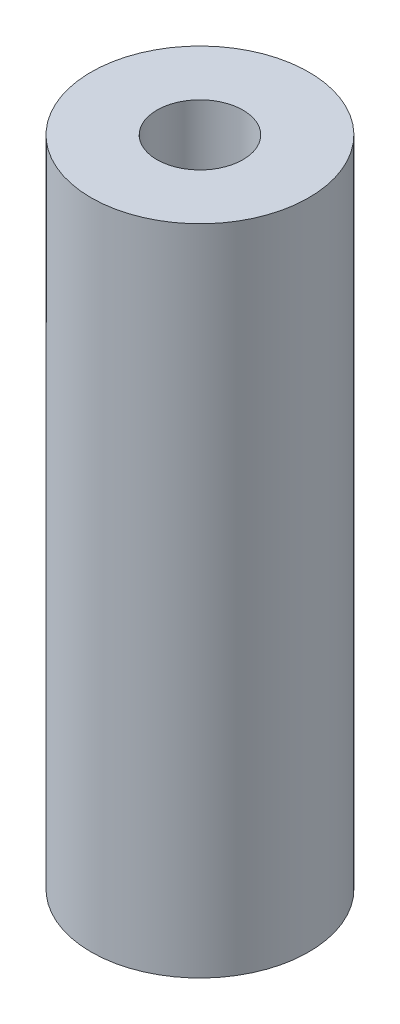
ISO-10303-21;
HEADER;
FILE_DESCRIPTION(('STEP AP214'),'2;1');
FILE_NAME('part.step','',(''),(''),'','','');
FILE_SCHEMA(('AUTOMOTIVE_DESIGN { 1 0 10303 214 1 1 1 1 }'));
ENDSEC;
DATA;
#1=APPLICATION_CONTEXT('core data for automotive mechanical design processes');
#2=APPLICATION_PROTOCOL_DEFINITION('international standard','automotive_design',2000,#1);
#3=PRODUCT_CONTEXT('',#1,'mechanical');
#4=PRODUCT('Part','Part','',(#3));
#5=PRODUCT_RELATED_PRODUCT_CATEGORY('part','',(#4));
#6=PRODUCT_DEFINITION_FORMATION('','',#4);
#7=PRODUCT_DEFINITION_CONTEXT('part definition',#1,'design');
#8=PRODUCT_DEFINITION('design','',#6,#7);
#9=PRODUCT_DEFINITION_SHAPE('','',#8);
#10=(LENGTH_UNIT() NAMED_UNIT(*) SI_UNIT(.MILLI.,.METRE.));
#11=(NAMED_UNIT(*) PLANE_ANGLE_UNIT() SI_UNIT($,.RADIAN.));
#12=(NAMED_UNIT(*) SI_UNIT($,.STERADIAN.) SOLID_ANGLE_UNIT());
#13=UNCERTAINTY_MEASURE_WITH_UNIT(LENGTH_MEASURE(1.E-05),#10,'distance_accuracy_value','');
#14=(GEOMETRIC_REPRESENTATION_CONTEXT(3) GLOBAL_UNCERTAINTY_ASSIGNED_CONTEXT((#13)) GLOBAL_UNIT_ASSIGNED_CONTEXT((#10,
#11,#12)) REPRESENTATION_CONTEXT('',''));
#15=CARTESIAN_POINT('',(0.,0.,0.));
#16=DIRECTION('',(0.,0.,1.));
#17=DIRECTION('',(1.,0.,0.));
#18=AXIS2_PLACEMENT_3D('',#15,#16,#17);
#19=CARTESIAN_POINT('',(0.,12.,0.));
#20=DIRECTION('',(0.,1.,0.));
#21=DIRECTION('',(0.,0.,1.));
#22=AXIS2_PLACEMENT_3D('',#19,#20,#21);
#23=PLANE('',#22);
#24=CARTESIAN_POINT('',(0.,12.,0.));
#25=DIRECTION('',(0.,1.,0.));
#26=DIRECTION('',(0.,0.,1.));
#27=AXIS2_PLACEMENT_3D('',#24,#25,#26);
#28=CIRCLE('',#27,2.);
#29=CARTESIAN_POINT('',(0.,12.,2.));
#30=VERTEX_POINT('',#29);
#31=EDGE_CURVE('E10',#30,#30,#28,.T.);
#32=ORIENTED_EDGE('',*,*,#31,.T.);
#33=EDGE_LOOP('',(#32));
#34=FACE_BOUND('',#33,.T.);
#35=CARTESIAN_POINT('',(0.,12.,0.));
#36=DIRECTION('',(0.,1.,0.));
#37=DIRECTION('',(0.,0.,1.));
#38=AXIS2_PLACEMENT_3D('',#35,#36,#37);
#39=CIRCLE('',#38,0.79);
#40=CARTESIAN_POINT('',(0.,12.,0.79));
#41=VERTEX_POINT('',#40);
#42=EDGE_CURVE('E54',#41,#41,#39,.T.);
#43=ORIENTED_EDGE('',*,*,#42,.F.);
#44=EDGE_LOOP('',(#43));
#45=FACE_BOUND('',#44,.T.);
#46=ADVANCED_FACE('F41',(#34,#45),#23,.T.);
#47=CARTESIAN_POINT('',(0.,0.,0.));
#48=DIRECTION('',(0.,1.,0.));
#49=DIRECTION('',(0.,0.,1.));
#50=AXIS2_PLACEMENT_3D('',#47,#48,#49);
#51=PLANE('',#50);
#52=CARTESIAN_POINT('',(0.,0.,0.));
#53=DIRECTION('',(0.,1.,0.));
#54=DIRECTION('',(0.,0.,1.));
#55=AXIS2_PLACEMENT_3D('',#52,#53,#54);
#56=CIRCLE('',#55,2.);
#57=CARTESIAN_POINT('',(0.,0.,2.));
#58=VERTEX_POINT('',#57);
#59=EDGE_CURVE('E45',#58,#58,#56,.T.);
#60=ORIENTED_EDGE('',*,*,#59,.F.);
#61=EDGE_LOOP('',(#60));
#62=FACE_BOUND('',#61,.T.);
#63=CARTESIAN_POINT('',(0.,0.,0.));
#64=DIRECTION('',(0.,1.,0.));
#65=DIRECTION('',(0.,0.,1.));
#66=AXIS2_PLACEMENT_3D('',#63,#64,#65);
#67=CIRCLE('',#66,0.79);
#68=CARTESIAN_POINT('',(0.,0.,0.79));
#69=VERTEX_POINT('',#68);
#70=EDGE_CURVE('E56',#69,#69,#67,.T.);
#71=ORIENTED_EDGE('',*,*,#70,.T.);
#72=EDGE_LOOP('',(#71));
#73=FACE_BOUND('',#72,.T.);
#74=ADVANCED_FACE('F68',(#62,#73),#51,.F.);
#75=CARTESIAN_POINT('',(0.,12.,0.));
#76=DIRECTION('',(0.,-1.,0.));
#77=DIRECTION('',(0.,0.,-1.));
#78=AXIS2_PLACEMENT_3D('',#75,#76,#77);
#79=CYLINDRICAL_SURFACE('',#78,2.);
#80=ORIENTED_EDGE('',*,*,#31,.F.);
#81=EDGE_LOOP('',(#80));
#82=FACE_BOUND('',#81,.T.);
#83=ORIENTED_EDGE('',*,*,#59,.T.);
#84=EDGE_LOOP('',(#83));
#85=FACE_BOUND('',#84,.T.);
#86=ADVANCED_FACE('F43',(#82,#85),#79,.T.);
#87=CARTESIAN_POINT('',(0.,12.,0.));
#88=DIRECTION('',(0.,-1.,0.));
#89=DIRECTION('',(0.,0.,-1.));
#90=AXIS2_PLACEMENT_3D('',#87,#88,#89);
#91=CYLINDRICAL_SURFACE('',#90,0.79);
#92=ORIENTED_EDGE('',*,*,#42,.T.);
#93=EDGE_LOOP('',(#92));
#94=FACE_BOUND('',#93,.T.);
#95=ORIENTED_EDGE('',*,*,#70,.F.);
#96=EDGE_LOOP('',(#95));
#97=FACE_BOUND('',#96,.T.);
#98=ADVANCED_FACE('F64',(#94,#97),#91,.F.);
#99=CLOSED_SHELL('',(#46,#74,#86,#98));
#100=MANIFOLD_SOLID_BREP('B2',#99);
#101=ADVANCED_BREP_SHAPE_REPRESENTATION('',(#18,#100),#14);
#102=SHAPE_DEFINITION_REPRESENTATION(#9,#101);
ENDSEC;
END-ISO-10303-21;
